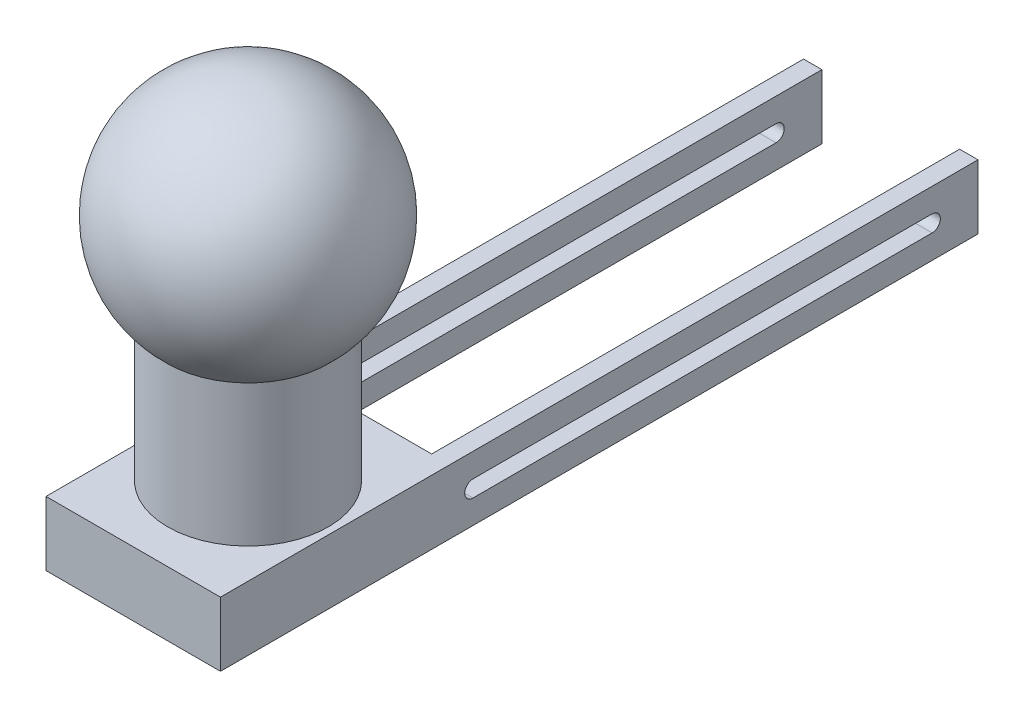
ISO-10303-21;
HEADER;
FILE_DESCRIPTION(('STEP AP214'),'2;1');
FILE_NAME('part.step','',(''),(''),'','','');
FILE_SCHEMA(('AUTOMOTIVE_DESIGN { 1 0 10303 214 1 1 1 1 }'));
ENDSEC;
DATA;
#1=APPLICATION_CONTEXT('core data for automotive mechanical design processes');
#2=APPLICATION_PROTOCOL_DEFINITION('international standard','automotive_design',2000,#1);
#3=PRODUCT_CONTEXT('',#1,'mechanical');
#4=PRODUCT('Part','Part','',(#3));
#5=PRODUCT_RELATED_PRODUCT_CATEGORY('part','',(#4));
#6=PRODUCT_DEFINITION_FORMATION('','',#4);
#7=PRODUCT_DEFINITION_CONTEXT('part definition',#1,'design');
#8=PRODUCT_DEFINITION('design','',#6,#7);
#9=PRODUCT_DEFINITION_SHAPE('','',#8);
#10=(LENGTH_UNIT() NAMED_UNIT(*) SI_UNIT(.MILLI.,.METRE.));
#11=(NAMED_UNIT(*) PLANE_ANGLE_UNIT() SI_UNIT($,.RADIAN.));
#12=(NAMED_UNIT(*) SI_UNIT($,.STERADIAN.) SOLID_ANGLE_UNIT());
#13=UNCERTAINTY_MEASURE_WITH_UNIT(LENGTH_MEASURE(1.E-05),#10,'distance_accuracy_value','');
#14=(GEOMETRIC_REPRESENTATION_CONTEXT(3) GLOBAL_UNCERTAINTY_ASSIGNED_CONTEXT((#13)) GLOBAL_UNIT_ASSIGNED_CONTEXT((#10,
#11,#12)) REPRESENTATION_CONTEXT('',''));
#15=CARTESIAN_POINT('',(0.,0.,0.));
#16=DIRECTION('',(0.,0.,1.));
#17=DIRECTION('',(1.,0.,0.));
#18=AXIS2_PLACEMENT_3D('',#15,#16,#17);
#19=CARTESIAN_POINT('',(0.,63.5,31.75));
#20=DIRECTION('',(0.,-1.,0.));
#21=DIRECTION('',(0.,0.,-1.));
#22=AXIS2_PLACEMENT_3D('',#19,#20,#21);
#23=CYLINDRICAL_SURFACE('',#22,22.225);
#24=CARTESIAN_POINT('',(0.,0.,31.75));
#25=DIRECTION('',(0.,1.,0.));
#26=DIRECTION('',(0.,0.,1.));
#27=AXIS2_PLACEMENT_3D('',#24,#25,#26);
#28=CIRCLE('',#27,22.225);
#29=CARTESIAN_POINT('',(0.,0.,53.975));
#30=VERTEX_POINT('',#29);
#31=EDGE_CURVE('E206',#30,#30,#28,.T.);
#32=ORIENTED_EDGE('',*,*,#31,.T.);
#33=EDGE_LOOP('',(#32));
#34=FACE_BOUND('',#33,.T.);
#35=CARTESIAN_POINT('',(0.,39.0793166557527,31.75));
#36=DIRECTION('',(0.,1.,0.));
#37=DIRECTION('',(0.,0.,1.));
#38=AXIS2_PLACEMENT_3D('',#35,#36,#37);
#39=CIRCLE('',#38,22.225);
#40=CARTESIAN_POINT('',(0.,39.0793166557527,53.975));
#41=VERTEX_POINT('',#40);
#42=EDGE_CURVE('E11',#41,#41,#39,.T.);
#43=ORIENTED_EDGE('',*,*,#42,.F.);
#44=EDGE_LOOP('',(#43));
#45=FACE_BOUND('',#44,.T.);
#46=ADVANCED_FACE('F35',(#34,#45),#23,.T.);
#47=CARTESIAN_POINT('',(-19.05,-17.78,0.));
#48=DIRECTION('',(1.,0.,0.));
#49=DIRECTION('',(0.,0.,-1.));
#50=AXIS2_PLACEMENT_3D('',#47,#48,#49);
#51=PLANE('',#50);
#52=CARTESIAN_POINT('',(-19.05,-8.89000000000002,-133.35));
#53=DIRECTION('',(1.,0.,0.));
#54=DIRECTION('',(0.,0.,-1.));
#55=AXIS2_PLACEMENT_3D('',#52,#53,#54);
#56=CIRCLE('',#55,2.286);
#57=CARTESIAN_POINT('',(-19.05,-11.176,-133.35));
#58=VERTEX_POINT('',#57);
#59=CARTESIAN_POINT('',(-19.05,-6.60400000000002,-133.35));
#60=VERTEX_POINT('',#59);
#61=EDGE_CURVE('E204',#58,#60,#56,.T.);
#62=ORIENTED_EDGE('',*,*,#61,.F.);
#63=DIRECTION('',(0.,0.,-1.));
#64=VECTOR('',#63,1.);
#65=CARTESIAN_POINT('',(-19.05,-11.176,0.));
#66=LINE('',#65,#64);
#67=CARTESIAN_POINT('',(-19.05,-11.176,-6.34999999999999));
#68=VERTEX_POINT('',#67);
#69=EDGE_CURVE('E186',#68,#58,#66,.T.);
#70=ORIENTED_EDGE('',*,*,#69,.F.);
#71=CARTESIAN_POINT('',(-19.05,-8.89000000000002,-6.34999999999999));
#72=DIRECTION('',(1.,0.,0.));
#73=DIRECTION('',(0.,0.,-1.));
#74=AXIS2_PLACEMENT_3D('',#71,#72,#73);
#75=CIRCLE('',#74,2.286);
#76=CARTESIAN_POINT('',(-19.05,-6.60400000000002,-6.34999999999999));
#77=VERTEX_POINT('',#76);
#78=EDGE_CURVE('E153',#77,#68,#75,.T.);
#79=ORIENTED_EDGE('',*,*,#78,.F.);
#80=DIRECTION('',(0.,0.,1.));
#81=VECTOR('',#80,1.);
#82=CARTESIAN_POINT('',(-19.05,-6.60400000000002,0.));
#83=LINE('',#82,#81);
#84=EDGE_CURVE('E198',#60,#77,#83,.T.);
#85=ORIENTED_EDGE('',*,*,#84,.F.);
#86=EDGE_LOOP('',(#62,#70,#79,#85));
#87=FACE_BOUND('',#86,.T.);
#88=DIRECTION('',(0.,0.,-1.));
#89=VECTOR('',#88,1.);
#90=CARTESIAN_POINT('',(-19.05,0.,0.));
#91=LINE('',#90,#89);
#92=CARTESIAN_POINT('',(-19.05,0.,0.));
#93=VERTEX_POINT('',#92);
#94=CARTESIAN_POINT('',(-19.05,0.,-146.05));
#95=VERTEX_POINT('',#94);
#96=EDGE_CURVE('E209',#93,#95,#91,.T.);
#97=ORIENTED_EDGE('',*,*,#96,.F.);
#98=DIRECTION('',(0.,1.,0.));
#99=VECTOR('',#98,1.);
#100=CARTESIAN_POINT('',(-19.05,-17.78,0.));
#101=LINE('',#100,#99);
#102=CARTESIAN_POINT('',(-19.05,-17.78,0.));
#103=VERTEX_POINT('',#102);
#104=EDGE_CURVE('E43',#103,#93,#101,.T.);
#105=ORIENTED_EDGE('',*,*,#104,.F.);
#106=DIRECTION('',(0.,0.,-1.));
#107=VECTOR('',#106,1.);
#108=CARTESIAN_POINT('',(-19.05,-17.78,0.));
#109=LINE('',#108,#107);
#110=CARTESIAN_POINT('',(-19.05,-17.78,-146.05));
#111=VERTEX_POINT('',#110);
#112=EDGE_CURVE('E210',#103,#111,#109,.T.);
#113=ORIENTED_EDGE('',*,*,#112,.T.);
#114=DIRECTION('',(0.,1.,0.));
#115=VECTOR('',#114,1.);
#116=CARTESIAN_POINT('',(-19.05,-17.78,-146.05));
#117=LINE('',#116,#115);
#118=EDGE_CURVE('E235',#111,#95,#117,.T.);
#119=ORIENTED_EDGE('',*,*,#118,.T.);
#120=EDGE_LOOP('',(#97,#105,#113,#119));
#121=FACE_BOUND('',#120,.T.);
#122=ADVANCED_FACE('F37',(#87,#121),#51,.T.);
#123=CARTESIAN_POINT('',(19.05,-17.78,0.));
#124=DIRECTION('',(0.,0.,-1.));
#125=DIRECTION('',(-1.,0.,0.));
#126=AXIS2_PLACEMENT_3D('',#123,#124,#125);
#127=PLANE('',#126);
#128=DIRECTION('',(-1.,0.,0.));
#129=VECTOR('',#128,1.);
#130=CARTESIAN_POINT('',(19.05,0.,0.));
#131=LINE('',#130,#129);
#132=CARTESIAN_POINT('',(19.05,0.,0.));
#133=VERTEX_POINT('',#132);
#134=EDGE_CURVE('E214',#133,#93,#131,.T.);
#135=ORIENTED_EDGE('',*,*,#134,.F.);
#136=DIRECTION('',(0.,1.,0.));
#137=VECTOR('',#136,1.);
#138=CARTESIAN_POINT('',(19.05,-17.78,0.));
#139=LINE('',#138,#137);
#140=CARTESIAN_POINT('',(19.05,-17.78,0.));
#141=VERTEX_POINT('',#140);
#142=EDGE_CURVE('E259',#141,#133,#139,.T.);
#143=ORIENTED_EDGE('',*,*,#142,.F.);
#144=DIRECTION('',(-1.,0.,0.));
#145=VECTOR('',#144,1.);
#146=CARTESIAN_POINT('',(19.05,-17.78,0.));
#147=LINE('',#146,#145);
#148=EDGE_CURVE('E232',#141,#103,#147,.T.);
#149=ORIENTED_EDGE('',*,*,#148,.T.);
#150=ORIENTED_EDGE('',*,*,#104,.T.);
#151=EDGE_LOOP('',(#135,#143,#149,#150));
#152=FACE_BOUND('',#151,.T.);
#153=ADVANCED_FACE('F283',(#152),#127,.T.);
#154=CARTESIAN_POINT('',(19.05,-17.78,0.));
#155=DIRECTION('',(-1.,0.,0.));
#156=DIRECTION('',(0.,0.,1.));
#157=AXIS2_PLACEMENT_3D('',#154,#155,#156);
#158=PLANE('',#157);
#159=CARTESIAN_POINT('',(19.05,-8.89000000000002,-133.35));
#160=DIRECTION('',(-1.,0.,0.));
#161=DIRECTION('',(0.,0.,1.));
#162=AXIS2_PLACEMENT_3D('',#159,#160,#161);
#163=CIRCLE('',#162,2.286);
#164=CARTESIAN_POINT('',(19.05,-6.60400000000002,-133.35));
#165=VERTEX_POINT('',#164);
#166=CARTESIAN_POINT('',(19.05,-11.176,-133.35));
#167=VERTEX_POINT('',#166);
#168=EDGE_CURVE('E202',#165,#167,#163,.T.);
#169=ORIENTED_EDGE('',*,*,#168,.F.);
#170=DIRECTION('',(0.,0.,-1.));
#171=VECTOR('',#170,1.);
#172=CARTESIAN_POINT('',(19.05,-6.60400000000002,0.));
#173=LINE('',#172,#171);
#174=CARTESIAN_POINT('',(19.05,-6.60400000000002,-6.35));
#175=VERTEX_POINT('',#174);
#176=EDGE_CURVE('E196',#175,#165,#173,.T.);
#177=ORIENTED_EDGE('',*,*,#176,.F.);
#178=CARTESIAN_POINT('',(19.05,-8.89000000000002,-6.35));
#179=DIRECTION('',(-1.,0.,0.));
#180=DIRECTION('',(0.,0.,1.));
#181=AXIS2_PLACEMENT_3D('',#178,#179,#180);
#182=CIRCLE('',#181,2.286);
#183=CARTESIAN_POINT('',(19.05,-11.176,-6.35));
#184=VERTEX_POINT('',#183);
#185=EDGE_CURVE('E191',#184,#175,#182,.T.);
#186=ORIENTED_EDGE('',*,*,#185,.F.);
#187=DIRECTION('',(0.,0.,1.));
#188=VECTOR('',#187,1.);
#189=CARTESIAN_POINT('',(19.05,-11.176,0.));
#190=LINE('',#189,#188);
#191=EDGE_CURVE('E184',#167,#184,#190,.T.);
#192=ORIENTED_EDGE('',*,*,#191,.F.);
#193=EDGE_LOOP('',(#169,#177,#186,#192));
#194=FACE_BOUND('',#193,.T.);
#195=DIRECTION('',(0.,0.,1.));
#196=VECTOR('',#195,1.);
#197=CARTESIAN_POINT('',(19.05,0.,0.));
#198=LINE('',#197,#196);
#199=CARTESIAN_POINT('',(19.05,0.,-146.05));
#200=VERTEX_POINT('',#199);
#201=EDGE_CURVE('E253',#200,#133,#198,.T.);
#202=ORIENTED_EDGE('',*,*,#201,.F.);
#203=DIRECTION('',(0.,1.,0.));
#204=VECTOR('',#203,1.);
#205=CARTESIAN_POINT('',(19.05,-17.78,-146.05));
#206=LINE('',#205,#204);
#207=CARTESIAN_POINT('',(19.05,-17.78,-146.05));
#208=VERTEX_POINT('',#207);
#209=EDGE_CURVE('E261',#208,#200,#206,.T.);
#210=ORIENTED_EDGE('',*,*,#209,.F.);
#211=DIRECTION('',(0.,0.,1.));
#212=VECTOR('',#211,1.);
#213=CARTESIAN_POINT('',(19.05,-17.78,0.));
#214=LINE('',#213,#212);
#215=EDGE_CURVE('E229',#208,#141,#214,.T.);
#216=ORIENTED_EDGE('',*,*,#215,.T.);
#217=ORIENTED_EDGE('',*,*,#142,.T.);
#218=EDGE_LOOP('',(#202,#210,#216,#217));
#219=FACE_BOUND('',#218,.T.);
#220=ADVANCED_FACE('F302',(#194,#219),#158,.T.);
#221=CARTESIAN_POINT('',(19.05,-17.78,-146.05));
#222=DIRECTION('',(0.,0.,-1.));
#223=DIRECTION('',(-1.,0.,0.));
#224=AXIS2_PLACEMENT_3D('',#221,#222,#223);
#225=PLANE('',#224);
#226=DIRECTION('',(-1.,0.,0.));
#227=VECTOR('',#226,1.);
#228=CARTESIAN_POINT('',(19.05,0.,-146.05));
#229=LINE('',#228,#227);
#230=CARTESIAN_POINT('',(24.13,0.,-146.05));
#231=VERTEX_POINT('',#230);
#232=EDGE_CURVE('E250',#231,#200,#229,.T.);
#233=ORIENTED_EDGE('',*,*,#232,.F.);
#234=DIRECTION('',(0.,1.,0.));
#235=VECTOR('',#234,1.);
#236=CARTESIAN_POINT('',(24.13,-17.78,-146.05));
#237=LINE('',#236,#235);
#238=CARTESIAN_POINT('',(24.13,-17.78,-146.05));
#239=VERTEX_POINT('',#238);
#240=EDGE_CURVE('E263',#239,#231,#237,.T.);
#241=ORIENTED_EDGE('',*,*,#240,.F.);
#242=DIRECTION('',(-1.,0.,0.));
#243=VECTOR('',#242,1.);
#244=CARTESIAN_POINT('',(19.05,-17.78,-146.05));
#245=LINE('',#244,#243);
#246=EDGE_CURVE('E226',#239,#208,#245,.T.);
#247=ORIENTED_EDGE('',*,*,#246,.T.);
#248=ORIENTED_EDGE('',*,*,#209,.T.);
#249=EDGE_LOOP('',(#233,#241,#247,#248));
#250=FACE_BOUND('',#249,.T.);
#251=ADVANCED_FACE('F300',(#250),#225,.T.);
#252=CARTESIAN_POINT('',(24.13,-17.78,-146.05));
#253=DIRECTION('',(1.,0.,0.));
#254=DIRECTION('',(0.,0.,-1.));
#255=AXIS2_PLACEMENT_3D('',#252,#253,#254);
#256=PLANE('',#255);
#257=CARTESIAN_POINT('',(24.13,-8.89000000000002,-133.35));
#258=DIRECTION('',(1.,0.,0.));
#259=DIRECTION('',(0.,0.,-1.));
#260=AXIS2_PLACEMENT_3D('',#257,#258,#259);
#261=CIRCLE('',#260,2.286);
#262=CARTESIAN_POINT('',(24.13,-11.176,-133.35));
#263=VERTEX_POINT('',#262);
#264=CARTESIAN_POINT('',(24.13,-6.60400000000002,-133.35));
#265=VERTEX_POINT('',#264);
#266=EDGE_CURVE('E200',#263,#265,#261,.T.);
#267=ORIENTED_EDGE('',*,*,#266,.F.);
#268=DIRECTION('',(0.,0.,-1.));
#269=VECTOR('',#268,1.);
#270=CARTESIAN_POINT('',(24.13,-11.176,-146.05));
#271=LINE('',#270,#269);
#272=CARTESIAN_POINT('',(24.13,-11.176,-6.34999999999999));
#273=VERTEX_POINT('',#272);
#274=EDGE_CURVE('E182',#273,#263,#271,.T.);
#275=ORIENTED_EDGE('',*,*,#274,.F.);
#276=CARTESIAN_POINT('',(24.13,-8.89000000000002,-6.35));
#277=DIRECTION('',(1.,0.,0.));
#278=DIRECTION('',(0.,0.,-1.));
#279=AXIS2_PLACEMENT_3D('',#276,#277,#278);
#280=CIRCLE('',#279,2.286);
#281=CARTESIAN_POINT('',(24.13,-6.60400000000002,-6.35));
#282=VERTEX_POINT('',#281);
#283=EDGE_CURVE('E188',#282,#273,#280,.T.);
#284=ORIENTED_EDGE('',*,*,#283,.F.);
#285=DIRECTION('',(0.,0.,1.));
#286=VECTOR('',#285,1.);
#287=CARTESIAN_POINT('',(24.13,-6.60400000000002,-146.05));
#288=LINE('',#287,#286);
#289=EDGE_CURVE('E194',#265,#282,#288,.T.);
#290=ORIENTED_EDGE('',*,*,#289,.F.);
#291=EDGE_LOOP('',(#267,#275,#284,#290));
#292=FACE_BOUND('',#291,.T.);
#293=DIRECTION('',(0.,0.,-1.));
#294=VECTOR('',#293,1.);
#295=CARTESIAN_POINT('',(24.13,0.,-146.05));
#296=LINE('',#295,#294);
#297=CARTESIAN_POINT('',(24.13,0.,63.5));
#298=VERTEX_POINT('',#297);
#299=EDGE_CURVE('E247',#298,#231,#296,.T.);
#300=ORIENTED_EDGE('',*,*,#299,.F.);
#301=DIRECTION('',(0.,1.,0.));
#302=VECTOR('',#301,1.);
#303=CARTESIAN_POINT('',(24.13,-17.78,63.5));
#304=LINE('',#303,#302);
#305=CARTESIAN_POINT('',(24.13,-17.78,63.5));
#306=VERTEX_POINT('',#305);
#307=EDGE_CURVE('E265',#306,#298,#304,.T.);
#308=ORIENTED_EDGE('',*,*,#307,.F.);
#309=DIRECTION('',(0.,0.,-1.));
#310=VECTOR('',#309,1.);
#311=CARTESIAN_POINT('',(24.13,-17.78,-146.05));
#312=LINE('',#311,#310);
#313=EDGE_CURVE('E223',#306,#239,#312,.T.);
#314=ORIENTED_EDGE('',*,*,#313,.T.);
#315=ORIENTED_EDGE('',*,*,#240,.T.);
#316=EDGE_LOOP('',(#300,#308,#314,#315));
#317=FACE_BOUND('',#316,.T.);
#318=ADVANCED_FACE('F296',(#292,#317),#256,.T.);
#319=CARTESIAN_POINT('',(-24.13,-17.78,63.5));
#320=DIRECTION('',(0.,0.,1.));
#321=DIRECTION('',(1.,0.,0.));
#322=AXIS2_PLACEMENT_3D('',#319,#320,#321);
#323=PLANE('',#322);
#324=DIRECTION('',(1.,0.,0.));
#325=VECTOR('',#324,1.);
#326=CARTESIAN_POINT('',(-24.13,0.,63.5));
#327=LINE('',#326,#325);
#328=CARTESIAN_POINT('',(-24.13,0.,63.5));
#329=VERTEX_POINT('',#328);
#330=EDGE_CURVE('E244',#329,#298,#327,.T.);
#331=ORIENTED_EDGE('',*,*,#330,.F.);
#332=DIRECTION('',(0.,1.,0.));
#333=VECTOR('',#332,1.);
#334=CARTESIAN_POINT('',(-24.13,-17.78,63.5));
#335=LINE('',#334,#333);
#336=CARTESIAN_POINT('',(-24.13,-17.78,63.5));
#337=VERTEX_POINT('',#336);
#338=EDGE_CURVE('E267',#337,#329,#335,.T.);
#339=ORIENTED_EDGE('',*,*,#338,.F.);
#340=DIRECTION('',(1.,0.,0.));
#341=VECTOR('',#340,1.);
#342=CARTESIAN_POINT('',(-24.13,-17.78,63.5));
#343=LINE('',#342,#341);
#344=EDGE_CURVE('E220',#337,#306,#343,.T.);
#345=ORIENTED_EDGE('',*,*,#344,.T.);
#346=ORIENTED_EDGE('',*,*,#307,.T.);
#347=EDGE_LOOP('',(#331,#339,#345,#346));
#348=FACE_BOUND('',#347,.T.);
#349=ADVANCED_FACE('F294',(#348),#323,.T.);
#350=CARTESIAN_POINT('',(-24.13,-17.78,-146.05));
#351=DIRECTION('',(-1.,0.,0.));
#352=DIRECTION('',(0.,0.,1.));
#353=AXIS2_PLACEMENT_3D('',#350,#351,#352);
#354=PLANE('',#353);
#355=CARTESIAN_POINT('',(-24.13,-8.89000000000002,-133.35));
#356=DIRECTION('',(-1.,0.,0.));
#357=DIRECTION('',(0.,0.,1.));
#358=AXIS2_PLACEMENT_3D('',#355,#356,#357);
#359=CIRCLE('',#358,2.286);
#360=CARTESIAN_POINT('',(-24.13,-6.60400000000002,-133.35));
#361=VERTEX_POINT('',#360);
#362=CARTESIAN_POINT('',(-24.13,-11.176,-133.35));
#363=VERTEX_POINT('',#362);
#364=EDGE_CURVE('E165',#361,#363,#359,.T.);
#365=ORIENTED_EDGE('',*,*,#364,.F.);
#366=DIRECTION('',(0.,0.,-1.));
#367=VECTOR('',#366,1.);
#368=CARTESIAN_POINT('',(-24.13,-6.60400000000002,-133.35));
#369=LINE('',#368,#367);
#370=CARTESIAN_POINT('',(-24.13,-6.60400000000002,-6.34999999999999));
#371=VERTEX_POINT('',#370);
#372=EDGE_CURVE('E170',#371,#361,#369,.T.);
#373=ORIENTED_EDGE('',*,*,#372,.F.);
#374=CARTESIAN_POINT('',(-24.13,-8.89000000000002,-6.34999999999999));
#375=DIRECTION('',(-1.,0.,0.));
#376=DIRECTION('',(0.,0.,1.));
#377=AXIS2_PLACEMENT_3D('',#374,#375,#376);
#378=CIRCLE('',#377,2.286);
#379=CARTESIAN_POINT('',(-24.13,-11.176,-6.34999999999999));
#380=VERTEX_POINT('',#379);
#381=EDGE_CURVE('E150',#380,#371,#378,.T.);
#382=ORIENTED_EDGE('',*,*,#381,.F.);
#383=DIRECTION('',(0.,0.,1.));
#384=VECTOR('',#383,1.);
#385=CARTESIAN_POINT('',(-24.13,-11.176,-133.35));
#386=LINE('',#385,#384);
#387=EDGE_CURVE('E159',#363,#380,#386,.T.);
#388=ORIENTED_EDGE('',*,*,#387,.F.);
#389=EDGE_LOOP('',(#365,#373,#382,#388));
#390=FACE_BOUND('',#389,.T.);
#391=DIRECTION('',(0.,0.,1.));
#392=VECTOR('',#391,1.);
#393=CARTESIAN_POINT('',(-24.13,0.,-146.05));
#394=LINE('',#393,#392);
#395=CARTESIAN_POINT('',(-24.13,0.,-146.05));
#396=VERTEX_POINT('',#395);
#397=EDGE_CURVE('E241',#396,#329,#394,.T.);
#398=ORIENTED_EDGE('',*,*,#397,.F.);
#399=DIRECTION('',(0.,1.,0.));
#400=VECTOR('',#399,1.);
#401=CARTESIAN_POINT('',(-24.13,-17.78,-146.05));
#402=LINE('',#401,#400);
#403=CARTESIAN_POINT('',(-24.13,-17.78,-146.05));
#404=VERTEX_POINT('',#403);
#405=EDGE_CURVE('E269',#404,#396,#402,.T.);
#406=ORIENTED_EDGE('',*,*,#405,.F.);
#407=DIRECTION('',(0.,0.,1.));
#408=VECTOR('',#407,1.);
#409=CARTESIAN_POINT('',(-24.13,-17.78,-146.05));
#410=LINE('',#409,#408);
#411=EDGE_CURVE('E217',#404,#337,#410,.T.);
#412=ORIENTED_EDGE('',*,*,#411,.T.);
#413=ORIENTED_EDGE('',*,*,#338,.T.);
#414=EDGE_LOOP('',(#398,#406,#412,#413));
#415=FACE_BOUND('',#414,.T.);
#416=ADVANCED_FACE('F167',(#390,#415),#354,.T.);
#417=CARTESIAN_POINT('',(-19.05,-17.78,-146.05));
#418=DIRECTION('',(0.,0.,-1.));
#419=DIRECTION('',(-1.,0.,0.));
#420=AXIS2_PLACEMENT_3D('',#417,#418,#419);
#421=PLANE('',#420);
#422=DIRECTION('',(-1.,0.,0.));
#423=VECTOR('',#422,1.);
#424=CARTESIAN_POINT('',(-19.05,0.,-146.05));
#425=LINE('',#424,#423);
#426=EDGE_CURVE('E238',#95,#396,#425,.T.);
#427=ORIENTED_EDGE('',*,*,#426,.F.);
#428=ORIENTED_EDGE('',*,*,#118,.F.);
#429=DIRECTION('',(-1.,0.,0.));
#430=VECTOR('',#429,1.);
#431=CARTESIAN_POINT('',(-19.05,-17.78,-146.05));
#432=LINE('',#431,#430);
#433=EDGE_CURVE('E213',#111,#404,#432,.T.);
#434=ORIENTED_EDGE('',*,*,#433,.T.);
#435=ORIENTED_EDGE('',*,*,#405,.T.);
#436=EDGE_LOOP('',(#427,#428,#434,#435));
#437=FACE_BOUND('',#436,.T.);
#438=ADVANCED_FACE('F276',(#437),#421,.T.);
#439=CARTESIAN_POINT('',(0.,-17.78,0.));
#440=DIRECTION('',(0.,1.,0.));
#441=DIRECTION('',(0.,0.,1.));
#442=AXIS2_PLACEMENT_3D('',#439,#440,#441);
#443=PLANE('',#442);
#444=ORIENTED_EDGE('',*,*,#112,.F.);
#445=ORIENTED_EDGE('',*,*,#148,.F.);
#446=ORIENTED_EDGE('',*,*,#215,.F.);
#447=ORIENTED_EDGE('',*,*,#246,.F.);
#448=ORIENTED_EDGE('',*,*,#313,.F.);
#449=ORIENTED_EDGE('',*,*,#344,.F.);
#450=ORIENTED_EDGE('',*,*,#411,.F.);
#451=ORIENTED_EDGE('',*,*,#433,.F.);
#452=EDGE_LOOP('',(#444,#445,#446,#447,#448,#449,#450,#451));
#453=FACE_BOUND('',#452,.T.);
#454=ADVANCED_FACE('F286',(#453),#443,.F.);
#455=CARTESIAN_POINT('',(0.,0.,0.));
#456=DIRECTION('',(0.,1.,0.));
#457=DIRECTION('',(0.,0.,1.));
#458=AXIS2_PLACEMENT_3D('',#455,#456,#457);
#459=PLANE('',#458);
#460=ORIENTED_EDGE('',*,*,#31,.F.);
#461=EDGE_LOOP('',(#460));
#462=FACE_BOUND('',#461,.T.);
#463=ORIENTED_EDGE('',*,*,#96,.T.);
#464=ORIENTED_EDGE('',*,*,#426,.T.);
#465=ORIENTED_EDGE('',*,*,#397,.T.);
#466=ORIENTED_EDGE('',*,*,#330,.T.);
#467=ORIENTED_EDGE('',*,*,#299,.T.);
#468=ORIENTED_EDGE('',*,*,#232,.T.);
#469=ORIENTED_EDGE('',*,*,#201,.T.);
#470=ORIENTED_EDGE('',*,*,#134,.T.);
#471=EDGE_LOOP('',(#463,#464,#465,#466,#467,#468,#469,#470));
#472=FACE_BOUND('',#471,.T.);
#473=ADVANCED_FACE('F279',(#462,#472),#459,.T.);
#474=CARTESIAN_POINT('',(0.,63.5,31.75));
#475=DIRECTION('',(-1.,0.,0.));
#476=DIRECTION('',(0.,1.,0.));
#477=AXIS2_PLACEMENT_3D('',#474,#475,#476);
#478=SPHERICAL_SURFACE('',#477,33.02);
#479=CARTESIAN_POINT('',(0.,63.5,31.75));
#480=DIRECTION('',(0.,1.,0.));
#481=DIRECTION('',(0.,0.,1.));
#482=AXIS2_PLACEMENT_3D('',#479,#480,#481);
#483=SPHERICAL_SURFACE('',#482,33.02);
#484=ORIENTED_EDGE('',*,*,#42,.T.);
#485=EDGE_LOOP('',(#484));
#486=FACE_BOUND('',#485,.T.);
#487=ADVANCED_FACE('F323',(#486),#483,.T.);
#488=CARTESIAN_POINT('',(33.02,-11.176,-133.35));
#489=DIRECTION('',(0.,-1.,0.));
#490=DIRECTION('',(0.,0.,-1.));
#491=AXIS2_PLACEMENT_3D('',#488,#489,#490);
#492=PLANE('',#491);
#493=ORIENTED_EDGE('',*,*,#69,.T.);
#494=DIRECTION('',(-1.,0.,0.));
#495=VECTOR('',#494,1.);
#496=CARTESIAN_POINT('',(33.02,-11.176,-133.35));
#497=LINE('',#496,#495);
#498=EDGE_CURVE('E162',#58,#363,#497,.T.);
#499=ORIENTED_EDGE('',*,*,#498,.T.);
#500=ORIENTED_EDGE('',*,*,#387,.T.);
#501=DIRECTION('',(-1.,0.,0.));
#502=VECTOR('',#501,1.);
#503=CARTESIAN_POINT('',(33.02,-11.176,-6.35));
#504=LINE('',#503,#502);
#505=EDGE_CURVE('E50',#68,#380,#504,.T.);
#506=ORIENTED_EDGE('',*,*,#505,.F.);
#507=EDGE_LOOP('',(#493,#499,#500,#506));
#508=FACE_BOUND('',#507,.T.);
#509=ADVANCED_FACE('F160',(#508),#492,.F.);
#510=CARTESIAN_POINT('',(33.02,-8.89000000000002,-6.35));
#511=DIRECTION('',(-1.,0.,0.));
#512=DIRECTION('',(0.,0.,1.));
#513=AXIS2_PLACEMENT_3D('',#510,#511,#512);
#514=CYLINDRICAL_SURFACE('',#513,2.286);
#515=ORIENTED_EDGE('',*,*,#78,.T.);
#516=ORIENTED_EDGE('',*,*,#505,.T.);
#517=ORIENTED_EDGE('',*,*,#381,.T.);
#518=DIRECTION('',(-1.,0.,0.));
#519=VECTOR('',#518,1.);
#520=CARTESIAN_POINT('',(33.02,-6.60400000000002,-6.35));
#521=LINE('',#520,#519);
#522=EDGE_CURVE('E179',#77,#371,#521,.T.);
#523=ORIENTED_EDGE('',*,*,#522,.F.);
#524=EDGE_LOOP('',(#515,#516,#517,#523));
#525=FACE_BOUND('',#524,.T.);
#526=ADVANCED_FACE('F147',(#525),#514,.F.);
#527=CARTESIAN_POINT('',(33.02,-6.60400000000002,-133.35));
#528=DIRECTION('',(0.,1.,0.));
#529=DIRECTION('',(0.,0.,1.));
#530=AXIS2_PLACEMENT_3D('',#527,#528,#529);
#531=PLANE('',#530);
#532=ORIENTED_EDGE('',*,*,#84,.T.);
#533=ORIENTED_EDGE('',*,*,#522,.T.);
#534=ORIENTED_EDGE('',*,*,#372,.T.);
#535=DIRECTION('',(-1.,0.,0.));
#536=VECTOR('',#535,1.);
#537=CARTESIAN_POINT('',(33.02,-6.60400000000002,-133.35));
#538=LINE('',#537,#536);
#539=EDGE_CURVE('E175',#60,#361,#538,.T.);
#540=ORIENTED_EDGE('',*,*,#539,.F.);
#541=EDGE_LOOP('',(#532,#533,#534,#540));
#542=FACE_BOUND('',#541,.T.);
#543=ADVANCED_FACE('F343',(#542),#531,.F.);
#544=CARTESIAN_POINT('',(33.02,-8.89000000000002,-133.35));
#545=DIRECTION('',(-1.,0.,0.));
#546=DIRECTION('',(0.,0.,1.));
#547=AXIS2_PLACEMENT_3D('',#544,#545,#546);
#548=CYLINDRICAL_SURFACE('',#547,2.286);
#549=ORIENTED_EDGE('',*,*,#61,.T.);
#550=ORIENTED_EDGE('',*,*,#539,.T.);
#551=ORIENTED_EDGE('',*,*,#364,.T.);
#552=ORIENTED_EDGE('',*,*,#498,.F.);
#553=EDGE_LOOP('',(#549,#550,#551,#552));
#554=FACE_BOUND('',#553,.T.);
#555=ADVANCED_FACE('F438',(#554),#548,.F.);
#556=ORIENTED_EDGE('',*,*,#168,.T.);
#557=EDGE_CURVE('E58',#263,#167,#497,.T.);
#558=ORIENTED_EDGE('',*,*,#557,.F.);
#559=ORIENTED_EDGE('',*,*,#266,.T.);
#560=EDGE_CURVE('E177',#265,#165,#538,.T.);
#561=ORIENTED_EDGE('',*,*,#560,.T.);
#562=EDGE_LOOP('',(#556,#558,#559,#561));
#563=FACE_BOUND('',#562,.T.);
#564=ADVANCED_FACE('F365',(#563),#548,.F.);
#565=ORIENTED_EDGE('',*,*,#176,.T.);
#566=ORIENTED_EDGE('',*,*,#560,.F.);
#567=ORIENTED_EDGE('',*,*,#289,.T.);
#568=EDGE_CURVE('E178',#282,#175,#521,.T.);
#569=ORIENTED_EDGE('',*,*,#568,.T.);
#570=EDGE_LOOP('',(#565,#566,#567,#569));
#571=FACE_BOUND('',#570,.T.);
#572=ADVANCED_FACE('F350',(#571),#531,.F.);
#573=ORIENTED_EDGE('',*,*,#185,.T.);
#574=ORIENTED_EDGE('',*,*,#568,.F.);
#575=ORIENTED_EDGE('',*,*,#283,.T.);
#576=EDGE_CURVE('E155',#273,#184,#504,.T.);
#577=ORIENTED_EDGE('',*,*,#576,.T.);
#578=EDGE_LOOP('',(#573,#574,#575,#577));
#579=FACE_BOUND('',#578,.T.);
#580=ADVANCED_FACE('F345',(#579),#514,.F.);
#581=ORIENTED_EDGE('',*,*,#191,.T.);
#582=ORIENTED_EDGE('',*,*,#576,.F.);
#583=ORIENTED_EDGE('',*,*,#274,.T.);
#584=ORIENTED_EDGE('',*,*,#557,.T.);
#585=EDGE_LOOP('',(#581,#582,#583,#584));
#586=FACE_BOUND('',#585,.T.);
#587=ADVANCED_FACE('F338',(#586),#492,.F.);
#588=CLOSED_SHELL('',(#46,#122,#153,#220,#251,#318,#349,#416,#438,#454,#473,#487,#509,#526,#543,
#555,#564,#572,#580,#587));
#589=MANIFOLD_SOLID_BREP('B2',#588);
#590=ADVANCED_BREP_SHAPE_REPRESENTATION('',(#18,#589),#14);
#591=SHAPE_DEFINITION_REPRESENTATION(#9,#590);
ENDSEC;
END-ISO-10303-21;
